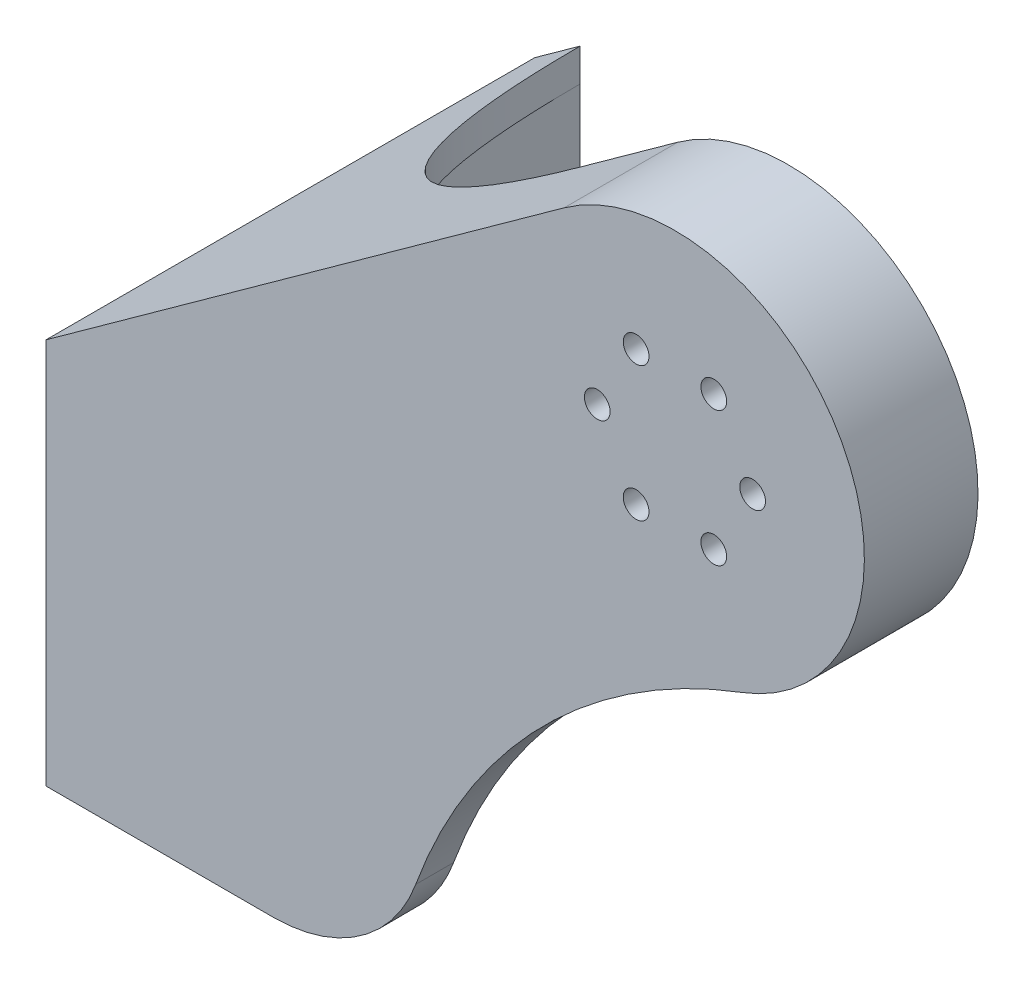
ISO-10303-21;
HEADER;
FILE_DESCRIPTION(('STEP AP214'),'2;1');
FILE_NAME('part.step','',(''),(''),'','','');
FILE_SCHEMA(('AUTOMOTIVE_DESIGN { 1 0 10303 214 1 1 1 1 }'));
ENDSEC;
DATA;
#1=APPLICATION_CONTEXT('core data for automotive mechanical design processes');
#2=APPLICATION_PROTOCOL_DEFINITION('international standard','automotive_design',2000,#1);
#3=PRODUCT_CONTEXT('',#1,'mechanical');
#4=PRODUCT('Part','Part','',(#3));
#5=PRODUCT_RELATED_PRODUCT_CATEGORY('part','',(#4));
#6=PRODUCT_DEFINITION_FORMATION('','',#4);
#7=PRODUCT_DEFINITION_CONTEXT('part definition',#1,'design');
#8=PRODUCT_DEFINITION('design','',#6,#7);
#9=PRODUCT_DEFINITION_SHAPE('','',#8);
#10=(LENGTH_UNIT() NAMED_UNIT(*) SI_UNIT(.MILLI.,.METRE.));
#11=(NAMED_UNIT(*) PLANE_ANGLE_UNIT() SI_UNIT($,.RADIAN.));
#12=(NAMED_UNIT(*) SI_UNIT($,.STERADIAN.) SOLID_ANGLE_UNIT());
#13=UNCERTAINTY_MEASURE_WITH_UNIT(LENGTH_MEASURE(1.E-05),#10,'distance_accuracy_value','');
#14=(GEOMETRIC_REPRESENTATION_CONTEXT(3) GLOBAL_UNCERTAINTY_ASSIGNED_CONTEXT((#13)) GLOBAL_UNIT_ASSIGNED_CONTEXT((#10,
#11,#12)) REPRESENTATION_CONTEXT('',''));
#15=CARTESIAN_POINT('',(0.,0.,0.));
#16=DIRECTION('',(0.,0.,1.));
#17=DIRECTION('',(1.,0.,0.));
#18=AXIS2_PLACEMENT_3D('',#15,#16,#17);
#19=CARTESIAN_POINT('',(-14.6165708263093,20.2819096063335,-5.));
#20=DIRECTION('',(-0.584662833052372,0.811276384253341,0.));
#21=DIRECTION('',(-0.81127638425334,-0.584662833052372,0.));
#22=AXIS2_PLACEMENT_3D('',#19,#20,#21);
#23=PLANE('',#22);
#24=DIRECTION('',(-0.81127638425334,-0.584662833052372,0.));
#25=VECTOR('',#24,1.);
#26=CARTESIAN_POINT('',(-14.6165708263093,20.2819096063335,-15.));
#27=LINE('',#26,#25);
#28=CARTESIAN_POINT('',(-14.6165708263093,20.2819096063335,-15.));
#29=VERTEX_POINT('',#28);
#30=CARTESIAN_POINT('',(-27.5,10.9972042379502,-15.));
#31=VERTEX_POINT('',#30);
#32=EDGE_CURVE('E394',#29,#31,#27,.T.);
#33=ORIENTED_EDGE('',*,*,#32,.T.);
#34=CARTESIAN_POINT('',(-27.5,10.9972042379502,-64.5));
#35=DIRECTION('',(-0.584662833052372,0.811276384253341,0.));
#36=DIRECTION('',(-0.81127638425334,-0.584662833052372,0.));
#37=AXIS2_PLACEMENT_3D('',#34,#35,#36);
#38=ELLIPSE('',#37,61.0149647651304,49.5);
#39=CARTESIAN_POINT('',(-77.,-24.6759779202216,-64.5));
#40=VERTEX_POINT('',#39);
#41=EDGE_CURVE('E392',#31,#40,#38,.F.);
#42=ORIENTED_EDGE('',*,*,#41,.T.);
#43=DIRECTION('',(0.811276384253341,0.584662833052372,0.));
#44=VECTOR('',#43,1.);
#45=CARTESIAN_POINT('',(-83.,-29.,-64.5));
#46=LINE('',#45,#44);
#47=CARTESIAN_POINT('',(-83.,-29.,-64.5));
#48=VERTEX_POINT('',#47);
#49=EDGE_CURVE('E456',#48,#40,#46,.T.);
#50=ORIENTED_EDGE('',*,*,#49,.F.);
#51=DIRECTION('',(0.,0.,1.));
#52=VECTOR('',#51,1.);
#53=CARTESIAN_POINT('',(-83.,-29.,-5.));
#54=LINE('',#53,#52);
#55=CARTESIAN_POINT('',(-83.,-29.,0.));
#56=VERTEX_POINT('',#55);
#57=EDGE_CURVE('E366',#48,#56,#54,.T.);
#58=ORIENTED_EDGE('',*,*,#57,.T.);
#59=DIRECTION('',(-0.811276384253341,-0.584662833052372,0.));
#60=VECTOR('',#59,1.);
#61=CARTESIAN_POINT('',(-14.6165708263093,20.2819096063335,0.));
#62=LINE('',#61,#60);
#63=CARTESIAN_POINT('',(-14.6165708263093,20.2819096063335,0.));
#64=VERTEX_POINT('',#63);
#65=EDGE_CURVE('E357',#64,#56,#62,.T.);
#66=ORIENTED_EDGE('',*,*,#65,.F.);
#67=DIRECTION('',(0.,0.,1.));
#68=VECTOR('',#67,1.);
#69=CARTESIAN_POINT('',(-14.6165708263093,20.2819096063335,-5.));
#70=LINE('',#69,#68);
#71=EDGE_CURVE('E369',#29,#64,#70,.T.);
#72=ORIENTED_EDGE('',*,*,#71,.F.);
#73=EDGE_LOOP('',(#33,#42,#50,#58,#66,#72));
#74=FACE_BOUND('',#73,.T.);
#75=ADVANCED_FACE('F148',(#74),#23,.T.);
#76=CARTESIAN_POINT('',(-77.,-29.,-64.5));
#77=DIRECTION('',(0.,0.,-1.));
#78=DIRECTION('',(-1.,0.,0.));
#79=AXIS2_PLACEMENT_3D('',#76,#77,#78);
#80=PLANE('',#79);
#81=DIRECTION('',(0.,1.,0.));
#82=VECTOR('',#81,1.);
#83=CARTESIAN_POINT('',(-77.,-80.,-64.5));
#84=LINE('',#83,#82);
#85=CARTESIAN_POINT('',(-77.,-80.,-64.5));
#86=VERTEX_POINT('',#85);
#87=CARTESIAN_POINT('',(-77.,-76.,-64.5));
#88=VERTEX_POINT('',#87);
#89=EDGE_CURVE('E236',#86,#88,#84,.T.);
#90=ORIENTED_EDGE('',*,*,#89,.F.);
#91=DIRECTION('',(-1.,0.,0.));
#92=VECTOR('',#91,1.);
#93=CARTESIAN_POINT('',(-77.,-80.,-64.5));
#94=LINE('',#93,#92);
#95=CARTESIAN_POINT('',(-83.,-80.,-64.5));
#96=VERTEX_POINT('',#95);
#97=EDGE_CURVE('E250',#86,#96,#94,.T.);
#98=ORIENTED_EDGE('',*,*,#97,.T.);
#99=DIRECTION('',(0.,-1.,0.));
#100=VECTOR('',#99,1.);
#101=CARTESIAN_POINT('',(-83.,-29.,-64.5));
#102=LINE('',#101,#100);
#103=EDGE_CURVE('E275',#48,#96,#102,.T.);
#104=ORIENTED_EDGE('',*,*,#103,.F.);
#105=ORIENTED_EDGE('',*,*,#49,.T.);
#106=DIRECTION('',(0.,-1.,0.));
#107=VECTOR('',#106,1.);
#108=CARTESIAN_POINT('',(-77.,25.,-64.5));
#109=LINE('',#108,#107);
#110=CARTESIAN_POINT('',(-77.,-29.,-64.5));
#111=VERTEX_POINT('',#110);
#112=EDGE_CURVE('E464',#40,#111,#109,.T.);
#113=ORIENTED_EDGE('',*,*,#112,.T.);
#114=DIRECTION('',(0.,-1.,0.));
#115=VECTOR('',#114,1.);
#116=CARTESIAN_POINT('',(-77.,-29.,-64.5));
#117=LINE('',#116,#115);
#118=EDGE_CURVE('E254',#111,#88,#117,.T.);
#119=ORIENTED_EDGE('',*,*,#118,.T.);
#120=EDGE_LOOP('',(#90,#98,#104,#105,#113,#119));
#121=FACE_BOUND('',#120,.T.);
#122=ADVANCED_FACE('F248',(#121),#80,.T.);
#123=CARTESIAN_POINT('',(-12.5655870561923,17.4359707110972,-150.463440724448));
#124=DIRECTION('',(-0.584662833052372,0.811276384253341,0.));
#125=DIRECTION('',(-0.811276384253341,-0.584662833052372,0.));
#126=AXIS2_PLACEMENT_3D('',#123,#124,#125);
#127=PLANE('',#126);
#128=CARTESIAN_POINT('',(-27.5,6.67318215817179,-64.5));
#129=DIRECTION('',(-0.584662833052372,0.811276384253341,0.));
#130=DIRECTION('',(-0.811276384253341,-0.584662833052372,0.));
#131=AXIS2_PLACEMENT_3D('',#128,#129,#130);
#132=ELLIPSE('',#131,61.0149647651304,49.5);
#133=CARTESIAN_POINT('',(-27.5,6.6731821581718,-15.));
#134=VERTEX_POINT('',#133);
#135=EDGE_CURVE('E12',#134,#111,#132,.F.);
#136=ORIENTED_EDGE('',*,*,#135,.F.);
#137=DIRECTION('',(-0.811276384253341,-0.584662833052372,0.));
#138=VECTOR('',#137,1.);
#139=CARTESIAN_POINT('',(-12.5655870561923,17.4359707110972,-15.));
#140=LINE('',#139,#138);
#141=CARTESIAN_POINT('',(-22.9262232645168,9.96936742353952,-15.));
#142=VERTEX_POINT('',#141);
#143=EDGE_CURVE('E157',#142,#134,#140,.T.);
#144=ORIENTED_EDGE('',*,*,#143,.F.);
#145=DIRECTION('',(0.,0.,1.));
#146=VECTOR('',#145,1.);
#147=CARTESIAN_POINT('',(-22.9262232645168,9.96936742353952,-5.));
#148=LINE('',#147,#146);
#149=CARTESIAN_POINT('',(-22.9262232645168,9.9693674235395,-5.));
#150=VERTEX_POINT('',#149);
#151=EDGE_CURVE('E453',#150,#142,#148,.F.);
#152=ORIENTED_EDGE('',*,*,#151,.F.);
#153=DIRECTION('',(-0.811276384253341,-0.584662833052372,0.));
#154=VECTOR('',#153,1.);
#155=CARTESIAN_POINT('',(-12.5655870561923,17.4359707110972,-5.));
#156=LINE('',#155,#154);
#157=CARTESIAN_POINT('',(-77.,-29.,-5.));
#158=VERTEX_POINT('',#157);
#159=EDGE_CURVE('E164',#150,#158,#156,.T.);
#160=ORIENTED_EDGE('',*,*,#159,.T.);
#161=DIRECTION('',(0.,0.,-1.));
#162=VECTOR('',#161,1.);
#163=CARTESIAN_POINT('',(-77.,-29.,-5.));
#164=LINE('',#163,#162);
#165=EDGE_CURVE('E271',#158,#111,#164,.T.);
#166=ORIENTED_EDGE('',*,*,#165,.T.);
#167=EDGE_LOOP('',(#136,#144,#152,#160,#166));
#168=FACE_BOUND('',#167,.T.);
#169=ADVANCED_FACE('F397',(#168),#127,.F.);
#170=CARTESIAN_POINT('',(0.,0.,-5.));
#171=DIRECTION('',(0.,0.,1.));
#172=DIRECTION('',(1.,0.,0.));
#173=AXIS2_PLACEMENT_3D('',#170,#171,#172);
#174=PLANE('',#173);
#175=ORIENTED_EDGE('',*,*,#159,.F.);
#176=CARTESIAN_POINT('',(0.,0.,-5.));
#177=DIRECTION('',(0.,0.,-1.));
#178=DIRECTION('',(-1.,0.,0.));
#179=AXIS2_PLACEMENT_3D('',#176,#177,#178);
#180=CIRCLE('',#179,25.);
#181=CARTESIAN_POINT('',(8.7896320255509,-23.4038964460068,-5.));
#182=VERTEX_POINT('',#181);
#183=EDGE_CURVE('E282',#182,#150,#180,.T.);
#184=ORIENTED_EDGE('',*,*,#183,.F.);
#185=CARTESIAN_POINT('',(34.4935847477768,-91.8450605374379,-5.));
#186=DIRECTION('',(0.,0.,1.));
#187=DIRECTION('',(1.,0.,0.));
#188=AXIS2_PLACEMENT_3D('',#185,#186,#187);
#189=CIRCLE('',#188,73.1087281228215);
#190=CARTESIAN_POINT('',(-34.2061475842818,-66.8404028665133,-5.));
#191=VERTEX_POINT('',#190);
#192=EDGE_CURVE('E313',#182,#191,#189,.T.);
#193=ORIENTED_EDGE('',*,*,#192,.T.);
#194=CARTESIAN_POINT('',(-53.,-60.,-5.));
#195=DIRECTION('',(0.,0.,1.));
#196=DIRECTION('',(1.,0.,0.));
#197=AXIS2_PLACEMENT_3D('',#194,#195,#196);
#198=CIRCLE('',#197,20.);
#199=CARTESIAN_POINT('',(-41.,-76.,-5.00000000000001));
#200=VERTEX_POINT('',#199);
#201=EDGE_CURVE('E310',#200,#191,#198,.T.);
#202=ORIENTED_EDGE('',*,*,#201,.F.);
#203=DIRECTION('',(-1.,0.,0.));
#204=VECTOR('',#203,1.);
#205=CARTESIAN_POINT('',(25.001,-76.,-5.));
#206=LINE('',#205,#204);
#207=CARTESIAN_POINT('',(-77.,-76.,-5.));
#208=VERTEX_POINT('',#207);
#209=EDGE_CURVE('E443',#200,#208,#206,.T.);
#210=ORIENTED_EDGE('',*,*,#209,.T.);
#211=DIRECTION('',(0.,1.,0.));
#212=VECTOR('',#211,1.);
#213=CARTESIAN_POINT('',(-77.,-80.,-5.));
#214=LINE('',#213,#212);
#215=EDGE_CURVE('E264',#208,#158,#214,.T.);
#216=ORIENTED_EDGE('',*,*,#215,.T.);
#217=EDGE_LOOP('',(#175,#184,#193,#202,#210,#216));
#218=FACE_BOUND('',#217,.T.);
#219=ADVANCED_FACE('F489',(#218),#174,.F.);
#220=CARTESIAN_POINT('',(0.,0.,-5.));
#221=DIRECTION('',(0.,0.,1.));
#222=DIRECTION('',(1.,0.,0.));
#223=AXIS2_PLACEMENT_3D('',#220,#221,#222);
#224=CYLINDRICAL_SURFACE('',#223,25.);
#225=CARTESIAN_POINT('',(0.,0.,-15.));
#226=DIRECTION('',(0.,0.,-1.));
#227=DIRECTION('',(-1.,0.,0.));
#228=AXIS2_PLACEMENT_3D('',#225,#226,#227);
#229=CIRCLE('',#228,25.);
#230=EDGE_CURVE('E172',#29,#142,#229,.T.);
#231=ORIENTED_EDGE('',*,*,#230,.F.);
#232=ORIENTED_EDGE('',*,*,#71,.T.);
#233=CARTESIAN_POINT('',(0.,0.,0.));
#234=DIRECTION('',(0.,0.,1.));
#235=DIRECTION('',(1.,0.,0.));
#236=AXIS2_PLACEMENT_3D('',#233,#234,#235);
#237=CIRCLE('',#236,25.);
#238=CARTESIAN_POINT('',(8.7896320255509,-23.4038964460068,0.));
#239=VERTEX_POINT('',#238);
#240=EDGE_CURVE('E353',#239,#64,#237,.T.);
#241=ORIENTED_EDGE('',*,*,#240,.F.);
#242=DIRECTION('',(0.,0.,1.));
#243=VECTOR('',#242,1.);
#244=CARTESIAN_POINT('',(8.7896320255509,-23.4038964460068,-5.));
#245=LINE('',#244,#243);
#246=EDGE_CURVE('E372',#182,#239,#245,.T.);
#247=ORIENTED_EDGE('',*,*,#246,.F.);
#248=ORIENTED_EDGE('',*,*,#183,.T.);
#249=ORIENTED_EDGE('',*,*,#151,.T.);
#250=EDGE_LOOP('',(#231,#232,#241,#247,#248,#249));
#251=FACE_BOUND('',#250,.T.);
#252=ADVANCED_FACE('F527',(#251),#224,.T.);
#253=CARTESIAN_POINT('',(0.,0.,-15.));
#254=DIRECTION('',(0.,0.,-1.));
#255=DIRECTION('',(-1.,0.,0.));
#256=AXIS2_PLACEMENT_3D('',#253,#254,#255);
#257=PLANE('',#256);
#258=ORIENTED_EDGE('',*,*,#32,.F.);
#259=ORIENTED_EDGE('',*,*,#230,.T.);
#260=ORIENTED_EDGE('',*,*,#143,.T.);
#261=DIRECTION('',(0.,-1.,0.));
#262=VECTOR('',#261,1.);
#263=CARTESIAN_POINT('',(-27.5,25.,-15.));
#264=LINE('',#263,#262);
#265=EDGE_CURVE('E256',#31,#134,#264,.T.);
#266=ORIENTED_EDGE('',*,*,#265,.F.);
#267=EDGE_LOOP('',(#258,#259,#260,#266));
#268=FACE_BOUND('',#267,.T.);
#269=CARTESIAN_POINT('',(0.,0.,-15.));
#270=DIRECTION('',(0.,0.,-1.));
#271=DIRECTION('',(-1.,0.,0.));
#272=AXIS2_PLACEMENT_3D('',#269,#270,#271);
#273=CIRCLE('',#272,19.);
#274=CARTESIAN_POINT('',(-19.,0.,-15.));
#275=VERTEX_POINT('',#274);
#276=EDGE_CURVE('E269',#275,#275,#273,.T.);
#277=ORIENTED_EDGE('',*,*,#276,.F.);
#278=EDGE_LOOP('',(#277));
#279=FACE_BOUND('',#278,.T.);
#280=ADVANCED_FACE('F382',(#268,#279),#257,.T.);
#281=CARTESIAN_POINT('',(-77.,0.,0.));
#282=DIRECTION('',(-1.,0.,0.));
#283=DIRECTION('',(0.,0.,1.));
#284=AXIS2_PLACEMENT_3D('',#281,#282,#283);
#285=PLANE('',#284);
#286=CARTESIAN_POINT('',(-77.,-39.,-55.));
#287=DIRECTION('',(-1.,0.,0.));
#288=DIRECTION('',(0.,0.,1.));
#289=AXIS2_PLACEMENT_3D('',#286,#287,#288);
#290=CIRCLE('',#289,1.7);
#291=CARTESIAN_POINT('',(-77.,-39.,-53.3));
#292=VERTEX_POINT('',#291);
#293=EDGE_CURVE('E410',#292,#292,#290,.T.);
#294=ORIENTED_EDGE('',*,*,#293,.T.);
#295=EDGE_LOOP('',(#294));
#296=FACE_BOUND('',#295,.T.);
#297=CARTESIAN_POINT('',(-77.,-39.,-24.));
#298=DIRECTION('',(-1.,0.,0.));
#299=DIRECTION('',(0.,0.,1.));
#300=AXIS2_PLACEMENT_3D('',#297,#298,#299);
#301=CIRCLE('',#300,1.7);
#302=CARTESIAN_POINT('',(-77.,-39.,-22.3));
#303=VERTEX_POINT('',#302);
#304=EDGE_CURVE('E411',#303,#303,#301,.T.);
#305=ORIENTED_EDGE('',*,*,#304,.T.);
#306=EDGE_LOOP('',(#305));
#307=FACE_BOUND('',#306,.T.);
#308=CARTESIAN_POINT('',(-77.,-70.,-24.));
#309=DIRECTION('',(-1.,0.,0.));
#310=DIRECTION('',(0.,0.,1.));
#311=AXIS2_PLACEMENT_3D('',#308,#309,#310);
#312=CIRCLE('',#311,1.7);
#313=CARTESIAN_POINT('',(-77.,-70.,-22.3));
#314=VERTEX_POINT('',#313);
#315=EDGE_CURVE('E419',#314,#314,#312,.T.);
#316=ORIENTED_EDGE('',*,*,#315,.T.);
#317=EDGE_LOOP('',(#316));
#318=FACE_BOUND('',#317,.T.);
#319=CARTESIAN_POINT('',(-77.,-70.,-55.));
#320=DIRECTION('',(-1.,0.,0.));
#321=DIRECTION('',(0.,0.,1.));
#322=AXIS2_PLACEMENT_3D('',#319,#320,#321);
#323=CIRCLE('',#322,1.7);
#324=CARTESIAN_POINT('',(-77.,-70.,-53.3));
#325=VERTEX_POINT('',#324);
#326=EDGE_CURVE('E427',#325,#325,#323,.T.);
#327=ORIENTED_EDGE('',*,*,#326,.T.);
#328=EDGE_LOOP('',(#327));
#329=FACE_BOUND('',#328,.T.);
#330=CARTESIAN_POINT('',(-77.,-54.5,-39.5));
#331=DIRECTION('',(-1.,0.,0.));
#332=DIRECTION('',(0.,0.,1.));
#333=AXIS2_PLACEMENT_3D('',#330,#331,#332);
#334=CIRCLE('',#333,19.);
#335=CARTESIAN_POINT('',(-77.,-54.5,-20.5));
#336=VERTEX_POINT('',#335);
#337=EDGE_CURVE('E435',#336,#336,#334,.T.);
#338=ORIENTED_EDGE('',*,*,#337,.T.);
#339=EDGE_LOOP('',(#338));
#340=FACE_BOUND('',#339,.T.);
#341=DIRECTION('',(0.,0.,1.));
#342=VECTOR('',#341,1.);
#343=CARTESIAN_POINT('',(-77.,-76.,-64.5));
#344=LINE('',#343,#342);
#345=EDGE_CURVE('E450',#88,#208,#344,.T.);
#346=ORIENTED_EDGE('',*,*,#345,.F.);
#347=ORIENTED_EDGE('',*,*,#118,.F.);
#348=ORIENTED_EDGE('',*,*,#165,.F.);
#349=ORIENTED_EDGE('',*,*,#215,.F.);
#350=EDGE_LOOP('',(#346,#347,#348,#349));
#351=FACE_BOUND('',#350,.T.);
#352=ADVANCED_FACE('F514',(#296,#307,#318,#329,#340,#351),#285,.F.);
#353=CARTESIAN_POINT('',(5.125,8.8767603887905,-5.));
#354=DIRECTION('',(0.,0.,1.));
#355=DIRECTION('',(1.,0.,0.));
#356=AXIS2_PLACEMENT_3D('',#353,#354,#355);
#357=CIRCLE('',#356,1.7);
#358=CARTESIAN_POINT('',(6.825,8.8767603887905,-5.));
#359=VERTEX_POINT('',#358);
#360=EDGE_CURVE('E306',#359,#359,#357,.T.);
#361=ORIENTED_EDGE('',*,*,#360,.T.);
#362=EDGE_LOOP('',(#361));
#363=FACE_BOUND('',#362,.T.);
#364=CARTESIAN_POINT('',(-5.125,8.87676038879049,-5.));
#365=DIRECTION('',(0.,0.,1.));
#366=DIRECTION('',(1.,0.,0.));
#367=AXIS2_PLACEMENT_3D('',#364,#365,#366);
#368=CIRCLE('',#367,1.7);
#369=CARTESIAN_POINT('',(-3.42500000000001,8.87676038879049,-5.));
#370=VERTEX_POINT('',#369);
#371=EDGE_CURVE('E302',#370,#370,#368,.T.);
#372=ORIENTED_EDGE('',*,*,#371,.T.);
#373=EDGE_LOOP('',(#372));
#374=FACE_BOUND('',#373,.T.);
#375=CARTESIAN_POINT('',(-10.25,0.,-5.));
#376=DIRECTION('',(0.,0.,1.));
#377=DIRECTION('',(1.,0.,0.));
#378=AXIS2_PLACEMENT_3D('',#375,#376,#377);
#379=CIRCLE('',#378,1.7);
#380=CARTESIAN_POINT('',(-8.55,0.,-5.));
#381=VERTEX_POINT('',#380);
#382=EDGE_CURVE('E298',#381,#381,#379,.T.);
#383=ORIENTED_EDGE('',*,*,#382,.T.);
#384=EDGE_LOOP('',(#383));
#385=FACE_BOUND('',#384,.T.);
#386=CARTESIAN_POINT('',(-5.125,-8.8767603887905,-5.));
#387=DIRECTION('',(0.,0.,1.));
#388=DIRECTION('',(1.,0.,0.));
#389=AXIS2_PLACEMENT_3D('',#386,#387,#388);
#390=CIRCLE('',#389,1.7);
#391=CARTESIAN_POINT('',(-3.425,-8.8767603887905,-5.));
#392=VERTEX_POINT('',#391);
#393=EDGE_CURVE('E294',#392,#392,#390,.T.);
#394=ORIENTED_EDGE('',*,*,#393,.T.);
#395=EDGE_LOOP('',(#394));
#396=FACE_BOUND('',#395,.T.);
#397=CARTESIAN_POINT('',(5.125,-8.8767603887905,-5.));
#398=DIRECTION('',(0.,0.,1.));
#399=DIRECTION('',(1.,0.,0.));
#400=AXIS2_PLACEMENT_3D('',#397,#398,#399);
#401=CIRCLE('',#400,1.7);
#402=CARTESIAN_POINT('',(6.825,-8.8767603887905,-5.));
#403=VERTEX_POINT('',#402);
#404=EDGE_CURVE('E289',#403,#403,#401,.T.);
#405=ORIENTED_EDGE('',*,*,#404,.T.);
#406=EDGE_LOOP('',(#405));
#407=FACE_BOUND('',#406,.T.);
#408=CARTESIAN_POINT('',(10.25,0.,-5.));
#409=DIRECTION('',(0.,0.,1.));
#410=DIRECTION('',(1.,0.,0.));
#411=AXIS2_PLACEMENT_3D('',#408,#409,#410);
#412=CIRCLE('',#411,1.7);
#413=CARTESIAN_POINT('',(11.95,0.,-5.));
#414=VERTEX_POINT('',#413);
#415=EDGE_CURVE('E285',#414,#414,#412,.T.);
#416=ORIENTED_EDGE('',*,*,#415,.T.);
#417=EDGE_LOOP('',(#416));
#418=FACE_BOUND('',#417,.T.);
#419=CARTESIAN_POINT('',(0.,0.,-5.));
#420=DIRECTION('',(0.,0.,-1.));
#421=DIRECTION('',(-1.,0.,0.));
#422=AXIS2_PLACEMENT_3D('',#419,#420,#421);
#423=CIRCLE('',#422,19.);
#424=CARTESIAN_POINT('',(-19.,0.,-5.));
#425=VERTEX_POINT('',#424);
#426=EDGE_CURVE('E263',#425,#425,#423,.T.);
#427=ORIENTED_EDGE('',*,*,#426,.T.);
#428=EDGE_LOOP('',(#427));
#429=FACE_BOUND('',#428,.T.);
#430=ADVANCED_FACE('F517',(#363,#374,#385,#396,#407,#418,#429),#174,.F.);
#431=CARTESIAN_POINT('',(0.,-80.,-5.));
#432=DIRECTION('',(0.,-1.,0.));
#433=DIRECTION('',(0.,0.,-1.));
#434=AXIS2_PLACEMENT_3D('',#431,#432,#433);
#435=PLANE('',#434);
#436=CARTESIAN_POINT('',(-9.82986111111103,-80.,-64.5));
#437=DIRECTION('',(0.,1.,0.));
#438=DIRECTION('',(0.,0.,1.));
#439=AXIS2_PLACEMENT_3D('',#436,#437,#438);
#440=CIRCLE('',#439,67.170138888889);
#441=CARTESIAN_POINT('',(-53.,-80.,-13.0396592834184));
#442=VERTEX_POINT('',#441);
#443=EDGE_CURVE('E233',#86,#442,#440,.T.);
#444=ORIENTED_EDGE('',*,*,#443,.T.);
#445=DIRECTION('',(0.,0.,1.));
#446=VECTOR('',#445,1.);
#447=CARTESIAN_POINT('',(-53.,-80.,-5.));
#448=LINE('',#447,#446);
#449=CARTESIAN_POINT('',(-53.,-80.,0.));
#450=VERTEX_POINT('',#449);
#451=EDGE_CURVE('E317',#442,#450,#448,.T.);
#452=ORIENTED_EDGE('',*,*,#451,.T.);
#453=DIRECTION('',(1.,0.,0.));
#454=VECTOR('',#453,1.);
#455=CARTESIAN_POINT('',(0.,-80.,0.));
#456=LINE('',#455,#454);
#457=CARTESIAN_POINT('',(-83.,-80.,0.));
#458=VERTEX_POINT('',#457);
#459=EDGE_CURVE('E341',#458,#450,#456,.T.);
#460=ORIENTED_EDGE('',*,*,#459,.F.);
#461=DIRECTION('',(0.,0.,1.));
#462=VECTOR('',#461,1.);
#463=CARTESIAN_POINT('',(-83.,-80.,-5.));
#464=LINE('',#463,#462);
#465=EDGE_CURVE('E260',#96,#458,#464,.T.);
#466=ORIENTED_EDGE('',*,*,#465,.F.);
#467=ORIENTED_EDGE('',*,*,#97,.F.);
#468=EDGE_LOOP('',(#444,#452,#460,#466,#467));
#469=FACE_BOUND('',#468,.T.);
#470=ADVANCED_FACE('F258',(#469),#435,.T.);
#471=CARTESIAN_POINT('',(-83.,0.,-5.));
#472=DIRECTION('',(-1.,0.,0.));
#473=DIRECTION('',(0.,0.,1.));
#474=AXIS2_PLACEMENT_3D('',#471,#472,#473);
#475=PLANE('',#474);
#476=DIRECTION('',(0.,-1.,0.));
#477=VECTOR('',#476,1.);
#478=CARTESIAN_POINT('',(-83.,0.,0.));
#479=LINE('',#478,#477);
#480=EDGE_CURVE('E290',#56,#458,#479,.T.);
#481=ORIENTED_EDGE('',*,*,#480,.F.);
#482=ORIENTED_EDGE('',*,*,#57,.F.);
#483=ORIENTED_EDGE('',*,*,#103,.T.);
#484=ORIENTED_EDGE('',*,*,#465,.T.);
#485=EDGE_LOOP('',(#481,#482,#483,#484));
#486=FACE_BOUND('',#485,.T.);
#487=CARTESIAN_POINT('',(-83.,-54.5,-39.5));
#488=DIRECTION('',(-1.,0.,0.));
#489=DIRECTION('',(0.,0.,1.));
#490=AXIS2_PLACEMENT_3D('',#487,#488,#489);
#491=CIRCLE('',#490,19.);
#492=CARTESIAN_POINT('',(-83.,-54.5,-20.5));
#493=VERTEX_POINT('',#492);
#494=EDGE_CURVE('E439',#493,#493,#491,.T.);
#495=ORIENTED_EDGE('',*,*,#494,.F.);
#496=EDGE_LOOP('',(#495));
#497=FACE_BOUND('',#496,.T.);
#498=CARTESIAN_POINT('',(-83.,-70.,-55.));
#499=DIRECTION('',(-1.,0.,0.));
#500=DIRECTION('',(0.,0.,1.));
#501=AXIS2_PLACEMENT_3D('',#498,#499,#500);
#502=CIRCLE('',#501,1.7);
#503=CARTESIAN_POINT('',(-83.,-70.,-53.3));
#504=VERTEX_POINT('',#503);
#505=EDGE_CURVE('E431',#504,#504,#502,.T.);
#506=ORIENTED_EDGE('',*,*,#505,.F.);
#507=EDGE_LOOP('',(#506));
#508=FACE_BOUND('',#507,.T.);
#509=CARTESIAN_POINT('',(-83.,-70.,-24.));
#510=DIRECTION('',(-1.,0.,0.));
#511=DIRECTION('',(0.,0.,1.));
#512=AXIS2_PLACEMENT_3D('',#509,#510,#511);
#513=CIRCLE('',#512,1.7);
#514=CARTESIAN_POINT('',(-83.,-70.,-22.3));
#515=VERTEX_POINT('',#514);
#516=EDGE_CURVE('E423',#515,#515,#513,.T.);
#517=ORIENTED_EDGE('',*,*,#516,.F.);
#518=EDGE_LOOP('',(#517));
#519=FACE_BOUND('',#518,.T.);
#520=CARTESIAN_POINT('',(-83.,-39.,-24.));
#521=DIRECTION('',(-1.,0.,0.));
#522=DIRECTION('',(0.,0.,1.));
#523=AXIS2_PLACEMENT_3D('',#520,#521,#522);
#524=CIRCLE('',#523,1.7);
#525=CARTESIAN_POINT('',(-83.,-39.,-22.3));
#526=VERTEX_POINT('',#525);
#527=EDGE_CURVE('E415',#526,#526,#524,.T.);
#528=ORIENTED_EDGE('',*,*,#527,.F.);
#529=EDGE_LOOP('',(#528));
#530=FACE_BOUND('',#529,.T.);
#531=CARTESIAN_POINT('',(-83.,-39.,-55.));
#532=DIRECTION('',(-1.,0.,0.));
#533=DIRECTION('',(0.,0.,1.));
#534=AXIS2_PLACEMENT_3D('',#531,#532,#533);
#535=CIRCLE('',#534,1.7);
#536=CARTESIAN_POINT('',(-83.,-39.,-53.3));
#537=VERTEX_POINT('',#536);
#538=EDGE_CURVE('E406',#537,#537,#535,.T.);
#539=ORIENTED_EDGE('',*,*,#538,.F.);
#540=EDGE_LOOP('',(#539));
#541=FACE_BOUND('',#540,.T.);
#542=ADVANCED_FACE('F533',(#486,#497,#508,#519,#530,#541),#475,.T.);
#543=CARTESIAN_POINT('',(34.4935847477768,-91.8450605374379,-5.));
#544=DIRECTION('',(0.,0.,1.));
#545=DIRECTION('',(1.,0.,0.));
#546=AXIS2_PLACEMENT_3D('',#543,#544,#545);
#547=CYLINDRICAL_SURFACE('',#546,73.1087281228215);
#548=CARTESIAN_POINT('',(34.4935847477768,-91.8450605374379,0.));
#549=DIRECTION('',(0.,0.,1.));
#550=DIRECTION('',(1.,0.,0.));
#551=AXIS2_PLACEMENT_3D('',#548,#549,#550);
#552=CIRCLE('',#551,73.1087281228215);
#553=CARTESIAN_POINT('',(-34.2061475842818,-66.8404028665133,0.));
#554=VERTEX_POINT('',#553);
#555=EDGE_CURVE('E349',#239,#554,#552,.T.);
#556=ORIENTED_EDGE('',*,*,#555,.T.);
#557=DIRECTION('',(0.,0.,1.));
#558=VECTOR('',#557,1.);
#559=CARTESIAN_POINT('',(-34.2061475842818,-66.8404028665133,-5.));
#560=LINE('',#559,#558);
#561=EDGE_CURVE('E375',#191,#554,#560,.T.);
#562=ORIENTED_EDGE('',*,*,#561,.F.);
#563=ORIENTED_EDGE('',*,*,#192,.F.);
#564=ORIENTED_EDGE('',*,*,#246,.T.);
#565=EDGE_LOOP('',(#556,#562,#563,#564));
#566=FACE_BOUND('',#565,.T.);
#567=ADVANCED_FACE('F536',(#566),#547,.F.);
#568=CARTESIAN_POINT('',(5.125,8.8767603887905,-5.));
#569=DIRECTION('',(0.,0.,1.));
#570=DIRECTION('',(1.,0.,0.));
#571=AXIS2_PLACEMENT_3D('',#568,#569,#570);
#572=CYLINDRICAL_SURFACE('',#571,1.7);
#573=ORIENTED_EDGE('',*,*,#360,.F.);
#574=EDGE_LOOP('',(#573));
#575=FACE_BOUND('',#574,.T.);
#576=CARTESIAN_POINT('',(5.125,8.8767603887905,0.));
#577=DIRECTION('',(0.,0.,1.));
#578=DIRECTION('',(1.,0.,0.));
#579=AXIS2_PLACEMENT_3D('',#576,#577,#578);
#580=CIRCLE('',#579,1.7);
#581=CARTESIAN_POINT('',(6.825,8.8767603887905,0.));
#582=VERTEX_POINT('',#581);
#583=EDGE_CURVE('E337',#582,#582,#580,.T.);
#584=ORIENTED_EDGE('',*,*,#583,.T.);
#585=EDGE_LOOP('',(#584));
#586=FACE_BOUND('',#585,.T.);
#587=ADVANCED_FACE('F544',(#575,#586),#572,.F.);
#588=CARTESIAN_POINT('',(-5.125,8.87676038879049,-5.));
#589=DIRECTION('',(0.,0.,1.));
#590=DIRECTION('',(1.,0.,0.));
#591=AXIS2_PLACEMENT_3D('',#588,#589,#590);
#592=CYLINDRICAL_SURFACE('',#591,1.7);
#593=ORIENTED_EDGE('',*,*,#371,.F.);
#594=EDGE_LOOP('',(#593));
#595=FACE_BOUND('',#594,.T.);
#596=CARTESIAN_POINT('',(-5.125,8.87676038879049,0.));
#597=DIRECTION('',(0.,0.,1.));
#598=DIRECTION('',(1.,0.,0.));
#599=AXIS2_PLACEMENT_3D('',#596,#597,#598);
#600=CIRCLE('',#599,1.7);
#601=CARTESIAN_POINT('',(-3.42500000000001,8.87676038879049,0.));
#602=VERTEX_POINT('',#601);
#603=EDGE_CURVE('E333',#602,#602,#600,.T.);
#604=ORIENTED_EDGE('',*,*,#603,.T.);
#605=EDGE_LOOP('',(#604));
#606=FACE_BOUND('',#605,.T.);
#607=ADVANCED_FACE('F550',(#595,#606),#592,.F.);
#608=CARTESIAN_POINT('',(-10.25,0.,-5.));
#609=DIRECTION('',(0.,0.,1.));
#610=DIRECTION('',(1.,0.,0.));
#611=AXIS2_PLACEMENT_3D('',#608,#609,#610);
#612=CYLINDRICAL_SURFACE('',#611,1.7);
#613=ORIENTED_EDGE('',*,*,#382,.F.);
#614=EDGE_LOOP('',(#613));
#615=FACE_BOUND('',#614,.T.);
#616=CARTESIAN_POINT('',(-10.25,0.,0.));
#617=DIRECTION('',(0.,0.,1.));
#618=DIRECTION('',(1.,0.,0.));
#619=AXIS2_PLACEMENT_3D('',#616,#617,#618);
#620=CIRCLE('',#619,1.7);
#621=CARTESIAN_POINT('',(-8.55,0.,0.));
#622=VERTEX_POINT('',#621);
#623=EDGE_CURVE('E329',#622,#622,#620,.T.);
#624=ORIENTED_EDGE('',*,*,#623,.T.);
#625=EDGE_LOOP('',(#624));
#626=FACE_BOUND('',#625,.T.);
#627=ADVANCED_FACE('F613',(#615,#626),#612,.F.);
#628=CARTESIAN_POINT('',(-5.125,-8.8767603887905,-5.));
#629=DIRECTION('',(0.,0.,1.));
#630=DIRECTION('',(1.,0.,0.));
#631=AXIS2_PLACEMENT_3D('',#628,#629,#630);
#632=CYLINDRICAL_SURFACE('',#631,1.7);
#633=ORIENTED_EDGE('',*,*,#393,.F.);
#634=EDGE_LOOP('',(#633));
#635=FACE_BOUND('',#634,.T.);
#636=CARTESIAN_POINT('',(-5.125,-8.8767603887905,0.));
#637=DIRECTION('',(0.,0.,1.));
#638=DIRECTION('',(1.,0.,0.));
#639=AXIS2_PLACEMENT_3D('',#636,#637,#638);
#640=CIRCLE('',#639,1.7);
#641=CARTESIAN_POINT('',(-3.425,-8.8767603887905,0.));
#642=VERTEX_POINT('',#641);
#643=EDGE_CURVE('E325',#642,#642,#640,.T.);
#644=ORIENTED_EDGE('',*,*,#643,.T.);
#645=EDGE_LOOP('',(#644));
#646=FACE_BOUND('',#645,.T.);
#647=ADVANCED_FACE('F595',(#635,#646),#632,.F.);
#648=CARTESIAN_POINT('',(5.125,-8.8767603887905,-5.));
#649=DIRECTION('',(0.,0.,1.));
#650=DIRECTION('',(1.,0.,0.));
#651=AXIS2_PLACEMENT_3D('',#648,#649,#650);
#652=CYLINDRICAL_SURFACE('',#651,1.7);
#653=ORIENTED_EDGE('',*,*,#404,.F.);
#654=EDGE_LOOP('',(#653));
#655=FACE_BOUND('',#654,.T.);
#656=CARTESIAN_POINT('',(5.125,-8.8767603887905,0.));
#657=DIRECTION('',(0.,0.,1.));
#658=DIRECTION('',(1.,0.,0.));
#659=AXIS2_PLACEMENT_3D('',#656,#657,#658);
#660=CIRCLE('',#659,1.7);
#661=CARTESIAN_POINT('',(6.825,-8.8767603887905,0.));
#662=VERTEX_POINT('',#661);
#663=EDGE_CURVE('E321',#662,#662,#660,.T.);
#664=ORIENTED_EDGE('',*,*,#663,.T.);
#665=EDGE_LOOP('',(#664));
#666=FACE_BOUND('',#665,.T.);
#667=ADVANCED_FACE('F590',(#655,#666),#652,.F.);
#668=CARTESIAN_POINT('',(10.25,0.,-5.));
#669=DIRECTION('',(0.,0.,1.));
#670=DIRECTION('',(1.,0.,0.));
#671=AXIS2_PLACEMENT_3D('',#668,#669,#670);
#672=CYLINDRICAL_SURFACE('',#671,1.7);
#673=ORIENTED_EDGE('',*,*,#415,.F.);
#674=EDGE_LOOP('',(#673));
#675=FACE_BOUND('',#674,.T.);
#676=CARTESIAN_POINT('',(10.25,0.,0.));
#677=DIRECTION('',(0.,0.,1.));
#678=DIRECTION('',(1.,0.,0.));
#679=AXIS2_PLACEMENT_3D('',#676,#677,#678);
#680=CIRCLE('',#679,1.7);
#681=CARTESIAN_POINT('',(11.95,0.,0.));
#682=VERTEX_POINT('',#681);
#683=EDGE_CURVE('E281',#682,#682,#680,.T.);
#684=ORIENTED_EDGE('',*,*,#683,.T.);
#685=EDGE_LOOP('',(#684));
#686=FACE_BOUND('',#685,.T.);
#687=ADVANCED_FACE('F150',(#675,#686),#672,.F.);
#688=CARTESIAN_POINT('',(-53.,-60.,-5.));
#689=DIRECTION('',(0.,0.,1.));
#690=DIRECTION('',(1.,0.,0.));
#691=AXIS2_PLACEMENT_3D('',#688,#689,#690);
#692=CYLINDRICAL_SURFACE('',#691,20.);
#693=CARTESIAN_POINT('',(-41.,-76.,-5.00000000000001));
#694=CARTESIAN_POINT('',(-41.2420072216841,-76.1815147643501,-5.12677396280374));
#695=CARTESIAN_POINT('',(-41.4869724292928,-76.3566502308427,-5.25699067489016));
#696=CARTESIAN_POINT('',(-41.9819657978769,-76.694087361679,-5.52416909103432));
#697=CARTESIAN_POINT('',(-42.2319933958885,-76.8563904433106,-5.66113004749686));
#698=CARTESIAN_POINT('',(-42.7360789448126,-77.167983452216,-5.9415546585203));
#699=CARTESIAN_POINT('',(-42.9901329495818,-77.3172852894922,-6.08501217467749));
#700=CARTESIAN_POINT('',(-43.5016833946085,-77.6030636556834,-6.37837800383302));
#701=CARTESIAN_POINT('',(-43.7591799076965,-77.7395399127652,-6.52828645345833));
#702=CARTESIAN_POINT('',(-44.5232978982569,-78.123606576189,-6.98011595445327));
#703=CARTESIAN_POINT('',(-45.0337776192166,-78.3533265452269,-7.29092434209061));
#704=CARTESIAN_POINT('',(-46.0596043871808,-78.7653040884698,-7.9349903689079));
#705=CARTESIAN_POINT('',(-46.5749520225485,-78.9475558473259,-8.26825075240166));
#706=CARTESIAN_POINT('',(-47.5855823856679,-79.2601332403118,-8.94203679822754));
#707=CARTESIAN_POINT('',(-48.0808574534461,-79.3922185660926,-9.28176178969872));
#708=CARTESIAN_POINT('',(-49.0680712746863,-79.616223306984,-9.97885098528013));
#709=CARTESIAN_POINT('',(-49.5600096231229,-79.7081379289549,-10.3362172886803));
#710=CARTESIAN_POINT('',(-50.5491965525781,-79.855717871485,-11.0757212346673));
#711=CARTESIAN_POINT('',(-51.0462923040705,-79.9104671401604,-11.4582462478334));
#712=CARTESIAN_POINT('',(-51.7847406563029,-79.9645699010205,-12.0432146384616));
#713=CARTESIAN_POINT('',(-52.0296400111708,-79.9779340980918,-12.2400249017093));
#714=CARTESIAN_POINT('',(-52.5168287376933,-79.9956477642826,-12.6372086274961));
#715=CARTESIAN_POINT('',(-52.7591183312979,-79.9999980061227,-12.8375817831211));
#716=CARTESIAN_POINT('',(-53.,-80.,-13.0396592834184));
#717=B_SPLINE_CURVE_WITH_KNOTS('',3,(#693,#694,#695,#696,#697,#698,#699,#700,#701,#702,#703,
#704,#705,#706,#707,#708,#709,#710,#711,#712,#713,#714,#715,#716),.UNSPECIFIED.,.F.,.F.,(4,2,2,
2,2,2,2,2,2,2,2,4),(0.,0.983893072197857,1.967677324918,2.95055067139038,3.93344484479572,
5.85180395505699,7.77039797381159,9.61356670475282,11.4569553012689,13.3442734621153,
14.2875348196453,15.2307153128365),.UNSPECIFIED.);
#718=EDGE_CURVE('E239',#200,#442,#717,.T.);
#719=ORIENTED_EDGE('',*,*,#718,.F.);
#720=ORIENTED_EDGE('',*,*,#201,.T.);
#721=ORIENTED_EDGE('',*,*,#561,.T.);
#722=CARTESIAN_POINT('',(-53.,-60.,0.));
#723=DIRECTION('',(0.,0.,1.));
#724=DIRECTION('',(1.,0.,0.));
#725=AXIS2_PLACEMENT_3D('',#722,#723,#724);
#726=CIRCLE('',#725,20.);
#727=EDGE_CURVE('E345',#450,#554,#726,.T.);
#728=ORIENTED_EDGE('',*,*,#727,.F.);
#729=ORIENTED_EDGE('',*,*,#451,.F.);
#730=EDGE_LOOP('',(#719,#720,#721,#728,#729));
#731=FACE_BOUND('',#730,.T.);
#732=ADVANCED_FACE('F477',(#731),#692,.T.);
#733=CARTESIAN_POINT('',(0.,0.,0.));
#734=DIRECTION('',(0.,0.,1.));
#735=DIRECTION('',(1.,0.,0.));
#736=AXIS2_PLACEMENT_3D('',#733,#734,#735);
#737=PLANE('',#736);
#738=ORIENTED_EDGE('',*,*,#683,.F.);
#739=EDGE_LOOP('',(#738));
#740=FACE_BOUND('',#739,.T.);
#741=ORIENTED_EDGE('',*,*,#663,.F.);
#742=EDGE_LOOP('',(#741));
#743=FACE_BOUND('',#742,.T.);
#744=ORIENTED_EDGE('',*,*,#643,.F.);
#745=EDGE_LOOP('',(#744));
#746=FACE_BOUND('',#745,.T.);
#747=ORIENTED_EDGE('',*,*,#623,.F.);
#748=EDGE_LOOP('',(#747));
#749=FACE_BOUND('',#748,.T.);
#750=ORIENTED_EDGE('',*,*,#603,.F.);
#751=EDGE_LOOP('',(#750));
#752=FACE_BOUND('',#751,.T.);
#753=ORIENTED_EDGE('',*,*,#583,.F.);
#754=EDGE_LOOP('',(#753));
#755=FACE_BOUND('',#754,.T.);
#756=ORIENTED_EDGE('',*,*,#459,.T.);
#757=ORIENTED_EDGE('',*,*,#727,.T.);
#758=ORIENTED_EDGE('',*,*,#555,.F.);
#759=ORIENTED_EDGE('',*,*,#240,.T.);
#760=ORIENTED_EDGE('',*,*,#65,.T.);
#761=ORIENTED_EDGE('',*,*,#480,.T.);
#762=EDGE_LOOP('',(#756,#757,#758,#759,#760,#761));
#763=FACE_BOUND('',#762,.T.);
#764=ADVANCED_FACE('F523',(#740,#743,#746,#749,#752,#755,#763),#737,.T.);
#765=CARTESIAN_POINT('',(0.,0.,-15.));
#766=DIRECTION('',(0.,0.,1.));
#767=DIRECTION('',(1.,0.,0.));
#768=AXIS2_PLACEMENT_3D('',#765,#766,#767);
#769=CYLINDRICAL_SURFACE('',#768,19.);
#770=ORIENTED_EDGE('',*,*,#276,.T.);
#771=EDGE_LOOP('',(#770));
#772=FACE_BOUND('',#771,.T.);
#773=ORIENTED_EDGE('',*,*,#426,.F.);
#774=EDGE_LOOP('',(#773));
#775=FACE_BOUND('',#774,.T.);
#776=ADVANCED_FACE('F512',(#772,#775),#769,.F.);
#777=CARTESIAN_POINT('',(-77.,-39.,-55.));
#778=DIRECTION('',(-1.,0.,0.));
#779=DIRECTION('',(0.,0.,1.));
#780=AXIS2_PLACEMENT_3D('',#777,#778,#779);
#781=CYLINDRICAL_SURFACE('',#780,1.7);
#782=ORIENTED_EDGE('',*,*,#293,.F.);
#783=EDGE_LOOP('',(#782));
#784=FACE_BOUND('',#783,.T.);
#785=ORIENTED_EDGE('',*,*,#538,.T.);
#786=EDGE_LOOP('',(#785));
#787=FACE_BOUND('',#786,.T.);
#788=ADVANCED_FACE('F508',(#784,#787),#781,.F.);
#789=CARTESIAN_POINT('',(-77.,-39.,-24.));
#790=DIRECTION('',(-1.,0.,0.));
#791=DIRECTION('',(0.,0.,1.));
#792=AXIS2_PLACEMENT_3D('',#789,#790,#791);
#793=CYLINDRICAL_SURFACE('',#792,1.7);
#794=ORIENTED_EDGE('',*,*,#304,.F.);
#795=EDGE_LOOP('',(#794));
#796=FACE_BOUND('',#795,.T.);
#797=ORIENTED_EDGE('',*,*,#527,.T.);
#798=EDGE_LOOP('',(#797));
#799=FACE_BOUND('',#798,.T.);
#800=ADVANCED_FACE('F504',(#796,#799),#793,.F.);
#801=CARTESIAN_POINT('',(-77.,-70.,-24.));
#802=DIRECTION('',(-1.,0.,0.));
#803=DIRECTION('',(0.,0.,1.));
#804=AXIS2_PLACEMENT_3D('',#801,#802,#803);
#805=CYLINDRICAL_SURFACE('',#804,1.7);
#806=ORIENTED_EDGE('',*,*,#315,.F.);
#807=EDGE_LOOP('',(#806));
#808=FACE_BOUND('',#807,.T.);
#809=ORIENTED_EDGE('',*,*,#516,.T.);
#810=EDGE_LOOP('',(#809));
#811=FACE_BOUND('',#810,.T.);
#812=ADVANCED_FACE('F500',(#808,#811),#805,.F.);
#813=CARTESIAN_POINT('',(-77.,-70.,-55.));
#814=DIRECTION('',(-1.,0.,0.));
#815=DIRECTION('',(0.,0.,1.));
#816=AXIS2_PLACEMENT_3D('',#813,#814,#815);
#817=CYLINDRICAL_SURFACE('',#816,1.7);
#818=ORIENTED_EDGE('',*,*,#326,.F.);
#819=EDGE_LOOP('',(#818));
#820=FACE_BOUND('',#819,.T.);
#821=ORIENTED_EDGE('',*,*,#505,.T.);
#822=EDGE_LOOP('',(#821));
#823=FACE_BOUND('',#822,.T.);
#824=ADVANCED_FACE('F496',(#820,#823),#817,.F.);
#825=CARTESIAN_POINT('',(-77.,-54.5,-39.5));
#826=DIRECTION('',(-1.,0.,0.));
#827=DIRECTION('',(0.,0.,1.));
#828=AXIS2_PLACEMENT_3D('',#825,#826,#827);
#829=CYLINDRICAL_SURFACE('',#828,19.);
#830=ORIENTED_EDGE('',*,*,#337,.F.);
#831=EDGE_LOOP('',(#830));
#832=FACE_BOUND('',#831,.T.);
#833=ORIENTED_EDGE('',*,*,#494,.T.);
#834=EDGE_LOOP('',(#833));
#835=FACE_BOUND('',#834,.T.);
#836=ADVANCED_FACE('F492',(#832,#835),#829,.F.);
#837=CARTESIAN_POINT('',(25.001,-76.,-64.5));
#838=DIRECTION('',(0.,-1.,0.));
#839=DIRECTION('',(0.,0.,-1.));
#840=AXIS2_PLACEMENT_3D('',#837,#838,#839);
#841=PLANE('',#840);
#842=ORIENTED_EDGE('',*,*,#209,.F.);
#843=CARTESIAN_POINT('',(-9.82986111111103,-76.,-64.5));
#844=DIRECTION('',(0.,1.,0.));
#845=DIRECTION('',(0.,0.,1.));
#846=AXIS2_PLACEMENT_3D('',#843,#844,#845);
#847=CIRCLE('',#846,67.170138888889);
#848=EDGE_CURVE('E244',#88,#200,#847,.T.);
#849=ORIENTED_EDGE('',*,*,#848,.F.);
#850=ORIENTED_EDGE('',*,*,#345,.T.);
#851=EDGE_LOOP('',(#842,#849,#850));
#852=FACE_BOUND('',#851,.T.);
#853=ADVANCED_FACE('F486',(#852),#841,.F.);
#854=CARTESIAN_POINT('',(-27.5,25.,-64.5));
#855=DIRECTION('',(0.,-1.,0.));
#856=DIRECTION('',(0.,0.,-1.));
#857=AXIS2_PLACEMENT_3D('',#854,#855,#856);
#858=CYLINDRICAL_SURFACE('',#857,49.5);
#859=ORIENTED_EDGE('',*,*,#265,.T.);
#860=ORIENTED_EDGE('',*,*,#135,.T.);
#861=ORIENTED_EDGE('',*,*,#112,.F.);
#862=ORIENTED_EDGE('',*,*,#41,.F.);
#863=EDGE_LOOP('',(#859,#860,#861,#862));
#864=FACE_BOUND('',#863,.T.);
#865=ADVANCED_FACE('F390',(#864),#858,.F.);
#866=CARTESIAN_POINT('',(-9.82986111111103,-80.,-64.5));
#867=DIRECTION('',(0.,1.,0.));
#868=DIRECTION('',(0.,0.,1.));
#869=AXIS2_PLACEMENT_3D('',#866,#867,#868);
#870=CYLINDRICAL_SURFACE('',#869,67.170138888889);
#871=ORIENTED_EDGE('',*,*,#89,.T.);
#872=ORIENTED_EDGE('',*,*,#848,.T.);
#873=ORIENTED_EDGE('',*,*,#718,.T.);
#874=ORIENTED_EDGE('',*,*,#443,.F.);
#875=EDGE_LOOP('',(#871,#872,#873,#874));
#876=FACE_BOUND('',#875,.T.);
#877=ADVANCED_FACE('F235',(#876),#870,.F.);
#878=CLOSED_SHELL('',(#75,#122,#169,#219,#252,#280,#352,#430,#470,#542,#567,#587,#607,#627,#647,
#667,#687,#732,#764,#776,#788,#800,#812,#824,#836,#853,#865,#877));
#879=MANIFOLD_SOLID_BREP('B2',#878);
#880=ADVANCED_BREP_SHAPE_REPRESENTATION('',(#18,#879),#14);
#881=SHAPE_DEFINITION_REPRESENTATION(#9,#880);
ENDSEC;
END-ISO-10303-21;
